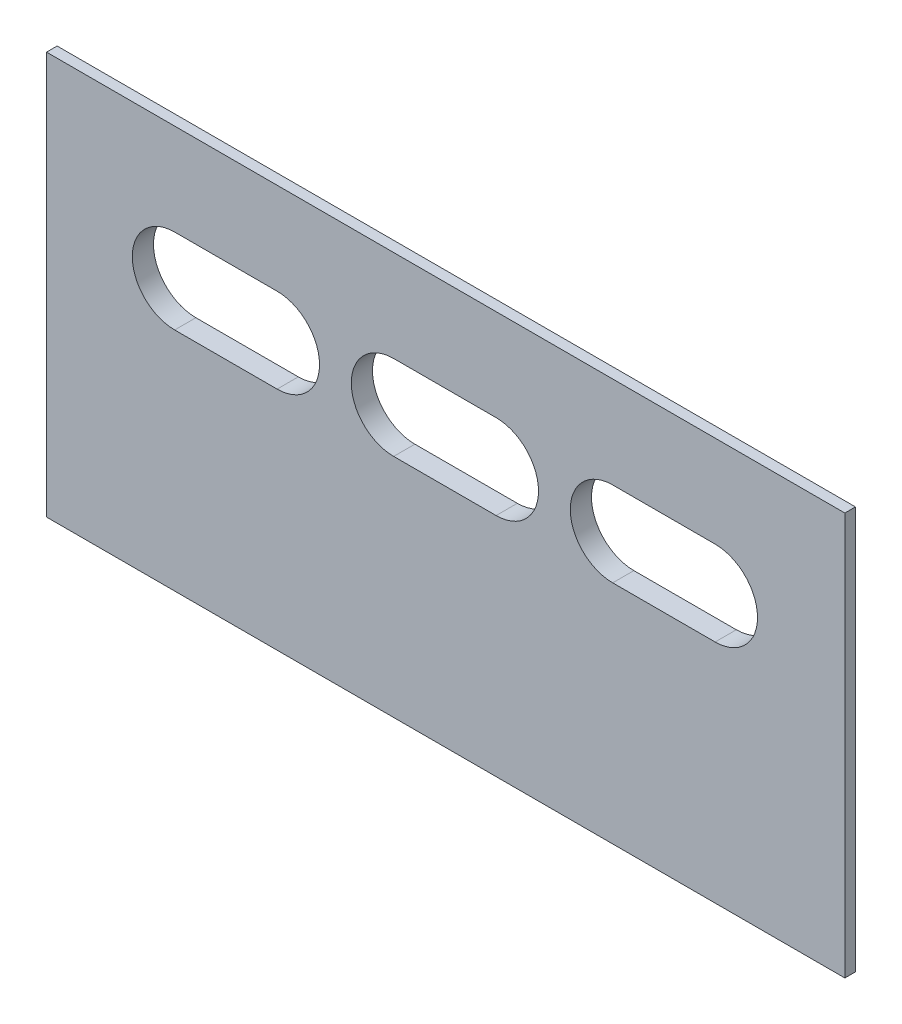
ISO-10303-21;
HEADER;
FILE_DESCRIPTION(('STEP AP214'),'2;1');
FILE_NAME('part.step','',(''),(''),'','','');
FILE_SCHEMA(('AUTOMOTIVE_DESIGN { 1 0 10303 214 1 1 1 1 }'));
ENDSEC;
DATA;
#1=APPLICATION_CONTEXT('core data for automotive mechanical design processes');
#2=APPLICATION_PROTOCOL_DEFINITION('international standard','automotive_design',2000,#1);
#3=PRODUCT_CONTEXT('',#1,'mechanical');
#4=PRODUCT('Part','Part','',(#3));
#5=PRODUCT_RELATED_PRODUCT_CATEGORY('part','',(#4));
#6=PRODUCT_DEFINITION_FORMATION('','',#4);
#7=PRODUCT_DEFINITION_CONTEXT('part definition',#1,'design');
#8=PRODUCT_DEFINITION('design','',#6,#7);
#9=PRODUCT_DEFINITION_SHAPE('','',#8);
#10=(LENGTH_UNIT() NAMED_UNIT(*) SI_UNIT(.MILLI.,.METRE.));
#11=(NAMED_UNIT(*) PLANE_ANGLE_UNIT() SI_UNIT($,.RADIAN.));
#12=(NAMED_UNIT(*) SI_UNIT($,.STERADIAN.) SOLID_ANGLE_UNIT());
#13=UNCERTAINTY_MEASURE_WITH_UNIT(LENGTH_MEASURE(1.E-05),#10,'distance_accuracy_value','');
#14=(GEOMETRIC_REPRESENTATION_CONTEXT(3) GLOBAL_UNCERTAINTY_ASSIGNED_CONTEXT((#13)) GLOBAL_UNIT_ASSIGNED_CONTEXT((#10,
#11,#12)) REPRESENTATION_CONTEXT('',''));
#15=CARTESIAN_POINT('',(0.,0.,0.));
#16=DIRECTION('',(0.,0.,1.));
#17=DIRECTION('',(1.,0.,0.));
#18=AXIS2_PLACEMENT_3D('',#15,#16,#17);
#19=CARTESIAN_POINT('',(5.,5.,37.5));
#20=DIRECTION('',(0.,0.,1.));
#21=DIRECTION('',(1.,0.,0.));
#22=AXIS2_PLACEMENT_3D('',#19,#20,#21);
#23=PLANE('',#22);
#24=DIRECTION('',(-1.,0.,0.));
#25=VECTOR('',#24,1.);
#26=CARTESIAN_POINT('',(43.568325892304,46.009172801273,37.5));
#27=LINE('',#26,#25);
#28=CARTESIAN_POINT('',(96.636651784609,46.009172801273,37.5));
#29=VERTEX_POINT('',#28);
#30=CARTESIAN_POINT('',(82.136651784609,46.009172801273,37.5));
#31=VERTEX_POINT('',#30);
#32=EDGE_CURVE('E430',#29,#31,#27,.T.);
#33=ORIENTED_EDGE('',*,*,#32,.T.);
#34=CARTESIAN_POINT('',(82.136651784609,40.009172801273,37.5));
#35=DIRECTION('',(0.,0.,-1.));
#36=DIRECTION('',(1.,0.,0.));
#37=AXIS2_PLACEMENT_3D('',#34,#35,#36);
#38=CIRCLE('',#37,6.);
#39=CARTESIAN_POINT('',(82.136651784609,34.009172801273,37.5));
#40=VERTEX_POINT('',#39);
#41=EDGE_CURVE('E438',#40,#31,#38,.T.);
#42=ORIENTED_EDGE('',*,*,#41,.F.);
#43=DIRECTION('',(-1.,0.,0.));
#44=VECTOR('',#43,1.);
#45=CARTESIAN_POINT('',(43.568325892304,34.009172801273,37.5));
#46=LINE('',#45,#44);
#47=CARTESIAN_POINT('',(96.636651784609,34.009172801273,37.5));
#48=VERTEX_POINT('',#47);
#49=EDGE_CURVE('E413',#48,#40,#46,.T.);
#50=ORIENTED_EDGE('',*,*,#49,.F.);
#51=CARTESIAN_POINT('',(96.636651784609,40.009172801273,37.5));
#52=DIRECTION('',(0.,0.,-1.));
#53=DIRECTION('',(1.,0.,0.));
#54=AXIS2_PLACEMENT_3D('',#51,#52,#53);
#55=CIRCLE('',#54,6.);
#56=EDGE_CURVE('E421',#29,#48,#55,.T.);
#57=ORIENTED_EDGE('',*,*,#56,.F.);
#58=EDGE_LOOP('',(#33,#42,#50,#57));
#59=FACE_BOUND('',#58,.T.);
#60=DIRECTION('',(-1.,0.,0.));
#61=VECTOR('',#60,1.);
#62=CARTESIAN_POINT('',(28.068325892304,46.009172801273,37.5));
#63=LINE('',#62,#61);
#64=CARTESIAN_POINT('',(65.636641784609,46.009172801273,37.5));
#65=VERTEX_POINT('',#64);
#66=CARTESIAN_POINT('',(51.136651784609,46.009172801273,37.5));
#67=VERTEX_POINT('',#66);
#68=EDGE_CURVE('E409',#65,#67,#63,.T.);
#69=ORIENTED_EDGE('',*,*,#68,.T.);
#70=CARTESIAN_POINT('',(51.136651784609,40.009172801273,37.5));
#71=DIRECTION('',(0.,0.,-1.));
#72=DIRECTION('',(1.,0.,0.));
#73=AXIS2_PLACEMENT_3D('',#70,#71,#72);
#74=CIRCLE('',#73,6.);
#75=CARTESIAN_POINT('',(51.136651784609,34.009172801273,37.5));
#76=VERTEX_POINT('',#75);
#77=EDGE_CURVE('E335',#76,#67,#74,.T.);
#78=ORIENTED_EDGE('',*,*,#77,.F.);
#79=DIRECTION('',(-1.,0.,0.));
#80=VECTOR('',#79,1.);
#81=CARTESIAN_POINT('',(28.068325892304,34.009172801273,37.5));
#82=LINE('',#81,#80);
#83=CARTESIAN_POINT('',(65.636641784609,34.009172801273,37.5));
#84=VERTEX_POINT('',#83);
#85=EDGE_CURVE('E412',#84,#76,#82,.T.);
#86=ORIENTED_EDGE('',*,*,#85,.F.);
#87=CARTESIAN_POINT('',(65.636641784609,40.009172801273,37.5));
#88=DIRECTION('',(0.,0.,-1.));
#89=DIRECTION('',(1.,0.,0.));
#90=AXIS2_PLACEMENT_3D('',#87,#88,#89);
#91=CIRCLE('',#90,6.);
#92=EDGE_CURVE('E372',#65,#84,#91,.T.);
#93=ORIENTED_EDGE('',*,*,#92,.F.);
#94=EDGE_LOOP('',(#69,#78,#86,#93));
#95=FACE_BOUND('',#94,.T.);
#96=DIRECTION('',(-1.,0.,0.));
#97=VECTOR('',#96,1.);
#98=CARTESIAN_POINT('',(12.568325892304,46.009172801273,37.5));
#99=LINE('',#98,#97);
#100=CARTESIAN_POINT('',(34.636651784609,46.009172801273,37.5));
#101=VERTEX_POINT('',#100);
#102=CARTESIAN_POINT('',(20.136651784609,46.009172801273,37.5));
#103=VERTEX_POINT('',#102);
#104=EDGE_CURVE('E380',#101,#103,#99,.T.);
#105=ORIENTED_EDGE('',*,*,#104,.T.);
#106=CARTESIAN_POINT('',(20.136651784609,40.009172801273,37.5));
#107=DIRECTION('',(0.,0.,-1.));
#108=DIRECTION('',(1.,0.,0.));
#109=AXIS2_PLACEMENT_3D('',#106,#107,#108);
#110=CIRCLE('',#109,6.);
#111=CARTESIAN_POINT('',(20.136651784609,34.009172801273,37.5));
#112=VERTEX_POINT('',#111);
#113=EDGE_CURVE('E391',#112,#103,#110,.T.);
#114=ORIENTED_EDGE('',*,*,#113,.F.);
#115=DIRECTION('',(-1.,0.,0.));
#116=VECTOR('',#115,1.);
#117=CARTESIAN_POINT('',(12.568325892304,34.009172801273,37.5));
#118=LINE('',#117,#116);
#119=CARTESIAN_POINT('',(34.636651784609,34.009172801273,37.5));
#120=VERTEX_POINT('',#119);
#121=EDGE_CURVE('E384',#120,#112,#118,.T.);
#122=ORIENTED_EDGE('',*,*,#121,.F.);
#123=CARTESIAN_POINT('',(34.636651784609,40.009172801273,37.5));
#124=DIRECTION('',(0.,0.,-1.));
#125=DIRECTION('',(1.,0.,0.));
#126=AXIS2_PLACEMENT_3D('',#123,#124,#125);
#127=CIRCLE('',#126,6.);
#128=EDGE_CURVE('E362',#101,#120,#127,.T.);
#129=ORIENTED_EDGE('',*,*,#128,.F.);
#130=EDGE_LOOP('',(#105,#114,#122,#129));
#131=FACE_BOUND('',#130,.T.);
#132=CARTESIAN_POINT('',(5.,12.,37.5));
#133=DIRECTION('',(0.,0.,1.));
#134=DIRECTION('',(0.,-1.,0.));
#135=AXIS2_PLACEMENT_3D('',#132,#133,#134);
#136=CIRCLE('',#135,1.5);
#137=CARTESIAN_POINT('',(5.,10.5,37.5));
#138=VERTEX_POINT('',#137);
#139=CARTESIAN_POINT('',(5.,13.5,37.5));
#140=VERTEX_POINT('',#139);
#141=EDGE_CURVE('E154',#138,#140,#136,.T.);
#142=ORIENTED_EDGE('',*,*,#141,.T.);
#143=DIRECTION('',(0.,1.,0.));
#144=VECTOR('',#143,1.);
#145=CARTESIAN_POINT('',(5.,5.,37.5));
#146=LINE('',#145,#144);
#147=CARTESIAN_POINT('',(5.,29.,37.5));
#148=VERTEX_POINT('',#147);
#149=EDGE_CURVE('E166',#140,#148,#146,.T.);
#150=ORIENTED_EDGE('',*,*,#149,.T.);
#151=CARTESIAN_POINT('',(5.,30.5,37.5));
#152=DIRECTION('',(0.,0.,1.));
#153=DIRECTION('',(0.,-1.,0.));
#154=AXIS2_PLACEMENT_3D('',#151,#152,#153);
#155=CIRCLE('',#154,1.5);
#156=CARTESIAN_POINT('',(5.,32.,37.5));
#157=VERTEX_POINT('',#156);
#158=EDGE_CURVE('E397',#148,#157,#155,.T.);
#159=ORIENTED_EDGE('',*,*,#158,.T.);
#160=DIRECTION('',(0.,1.,0.));
#161=VECTOR('',#160,1.);
#162=CARTESIAN_POINT('',(5.,5.,37.5));
#163=LINE('',#162,#161);
#164=CARTESIAN_POINT('',(5.,47.5,37.5));
#165=VERTEX_POINT('',#164);
#166=EDGE_CURVE('E488',#157,#165,#163,.T.);
#167=ORIENTED_EDGE('',*,*,#166,.T.);
#168=CARTESIAN_POINT('',(5.,49.,37.5));
#169=DIRECTION('',(0.,0.,1.));
#170=DIRECTION('',(0.,-1.,0.));
#171=AXIS2_PLACEMENT_3D('',#168,#169,#170);
#172=CIRCLE('',#171,1.5);
#173=CARTESIAN_POINT('',(5.,50.5,37.5));
#174=VERTEX_POINT('',#173);
#175=EDGE_CURVE('E491',#165,#174,#172,.T.);
#176=ORIENTED_EDGE('',*,*,#175,.T.);
#177=DIRECTION('',(0.,1.,0.));
#178=VECTOR('',#177,1.);
#179=CARTESIAN_POINT('',(5.,5.,37.5));
#180=LINE('',#179,#178);
#181=CARTESIAN_POINT('',(5.,56.,37.5));
#182=VERTEX_POINT('',#181);
#183=EDGE_CURVE('E9',#174,#182,#180,.T.);
#184=ORIENTED_EDGE('',*,*,#183,.T.);
#185=DIRECTION('',(1.,0.,0.));
#186=VECTOR('',#185,1.);
#187=CARTESIAN_POINT('',(5.,56.,37.5));
#188=LINE('',#187,#186);
#189=CARTESIAN_POINT('',(112.,56.,37.5));
#190=VERTEX_POINT('',#189);
#191=EDGE_CURVE('E416',#182,#190,#188,.T.);
#192=ORIENTED_EDGE('',*,*,#191,.T.);
#193=DIRECTION('',(0.,1.,0.));
#194=VECTOR('',#193,1.);
#195=CARTESIAN_POINT('',(112.,5.,37.5));
#196=LINE('',#195,#194);
#197=CARTESIAN_POINT('',(112.,50.5,37.5));
#198=VERTEX_POINT('',#197);
#199=EDGE_CURVE('E363',#198,#190,#196,.T.);
#200=ORIENTED_EDGE('',*,*,#199,.F.);
#201=CARTESIAN_POINT('',(112.,49.,37.5));
#202=DIRECTION('',(0.,0.,-1.));
#203=DIRECTION('',(1.,0.,0.));
#204=AXIS2_PLACEMENT_3D('',#201,#202,#203);
#205=CIRCLE('',#204,1.5);
#206=CARTESIAN_POINT('',(112.,47.5,37.5));
#207=VERTEX_POINT('',#206);
#208=EDGE_CURVE('E406',#207,#198,#205,.T.);
#209=ORIENTED_EDGE('',*,*,#208,.F.);
#210=DIRECTION('',(0.,1.,0.));
#211=VECTOR('',#210,1.);
#212=CARTESIAN_POINT('',(112.,5.,37.5));
#213=LINE('',#212,#211);
#214=CARTESIAN_POINT('',(112.,32.,37.5));
#215=VERTEX_POINT('',#214);
#216=EDGE_CURVE('E405',#215,#207,#213,.T.);
#217=ORIENTED_EDGE('',*,*,#216,.F.);
#218=CARTESIAN_POINT('',(112.,30.5,37.5));
#219=DIRECTION('',(0.,0.,-1.));
#220=DIRECTION('',(1.,0.,0.));
#221=AXIS2_PLACEMENT_3D('',#218,#219,#220);
#222=CIRCLE('',#221,1.5);
#223=CARTESIAN_POINT('',(112.,29.,37.5));
#224=VERTEX_POINT('',#223);
#225=EDGE_CURVE('E305',#224,#215,#222,.T.);
#226=ORIENTED_EDGE('',*,*,#225,.F.);
#227=DIRECTION('',(0.,1.,0.));
#228=VECTOR('',#227,1.);
#229=CARTESIAN_POINT('',(112.,5.,37.5));
#230=LINE('',#229,#228);
#231=CARTESIAN_POINT('',(112.,13.5,37.5));
#232=VERTEX_POINT('',#231);
#233=EDGE_CURVE('E304',#232,#224,#230,.T.);
#234=ORIENTED_EDGE('',*,*,#233,.F.);
#235=CARTESIAN_POINT('',(112.,12.,37.5));
#236=DIRECTION('',(0.,0.,-1.));
#237=DIRECTION('',(1.,0.,0.));
#238=AXIS2_PLACEMENT_3D('',#235,#236,#237);
#239=CIRCLE('',#238,1.5);
#240=CARTESIAN_POINT('',(112.,10.5,37.5));
#241=VERTEX_POINT('',#240);
#242=EDGE_CURVE('E300',#241,#232,#239,.T.);
#243=ORIENTED_EDGE('',*,*,#242,.F.);
#244=DIRECTION('',(0.,1.,0.));
#245=VECTOR('',#244,1.);
#246=CARTESIAN_POINT('',(112.,5.,37.5));
#247=LINE('',#246,#245);
#248=CARTESIAN_POINT('',(112.,5.,37.5));
#249=VERTEX_POINT('',#248);
#250=EDGE_CURVE('E470',#249,#241,#247,.T.);
#251=ORIENTED_EDGE('',*,*,#250,.F.);
#252=DIRECTION('',(1.,0.,0.));
#253=VECTOR('',#252,1.);
#254=CARTESIAN_POINT('',(5.,5.,37.5));
#255=LINE('',#254,#253);
#256=CARTESIAN_POINT('',(5.,5.,37.5));
#257=VERTEX_POINT('',#256);
#258=EDGE_CURVE('E449',#257,#249,#255,.T.);
#259=ORIENTED_EDGE('',*,*,#258,.F.);
#260=DIRECTION('',(0.,1.,0.));
#261=VECTOR('',#260,1.);
#262=CARTESIAN_POINT('',(5.,5.,37.5));
#263=LINE('',#262,#261);
#264=EDGE_CURVE('E333',#257,#138,#263,.T.);
#265=ORIENTED_EDGE('',*,*,#264,.T.);
#266=EDGE_LOOP('',(#142,#150,#159,#167,#176,#184,#192,#200,#209,#217,#226,#234,#243,#251,#259,#265));
#267=FACE_BOUND('',#266,.T.);
#268=ADVANCED_FACE('F15',(#59,#95,#131,#267),#23,.F.);
#269=CARTESIAN_POINT('',(5.,5.,37.5));
#270=DIRECTION('',(1.,0.,0.));
#271=DIRECTION('',(0.,1.,0.));
#272=AXIS2_PLACEMENT_3D('',#269,#270,#271);
#273=PLANE('',#272);
#274=DIRECTION('',(0.,0.,1.));
#275=VECTOR('',#274,1.);
#276=CARTESIAN_POINT('',(5.,56.,37.5));
#277=LINE('',#276,#275);
#278=CARTESIAN_POINT('',(5.,56.,39.));
#279=VERTEX_POINT('',#278);
#280=EDGE_CURVE('E446',#182,#279,#277,.T.);
#281=ORIENTED_EDGE('',*,*,#280,.F.);
#282=ORIENTED_EDGE('',*,*,#183,.F.);
#283=DIRECTION('',(0.,0.,-1.));
#284=VECTOR('',#283,1.);
#285=CARTESIAN_POINT('',(5.,50.5,37.));
#286=LINE('',#285,#284);
#287=CARTESIAN_POINT('',(5.,50.5,39.));
#288=VERTEX_POINT('',#287);
#289=EDGE_CURVE('E24',#288,#174,#286,.T.);
#290=ORIENTED_EDGE('',*,*,#289,.F.);
#291=DIRECTION('',(0.,1.,0.));
#292=VECTOR('',#291,1.);
#293=CARTESIAN_POINT('',(5.,5.,39.));
#294=LINE('',#293,#292);
#295=EDGE_CURVE('E547',#288,#279,#294,.T.);
#296=ORIENTED_EDGE('',*,*,#295,.T.);
#297=EDGE_LOOP('',(#281,#282,#290,#296));
#298=FACE_BOUND('',#297,.T.);
#299=ADVANCED_FACE('F631',(#298),#273,.F.);
#300=CARTESIAN_POINT('',(5.,49.,37.));
#301=DIRECTION('',(0.,0.,-1.));
#302=DIRECTION('',(1.,0.,0.));
#303=AXIS2_PLACEMENT_3D('',#300,#301,#302);
#304=CYLINDRICAL_SURFACE('',#303,1.5);
#305=ORIENTED_EDGE('',*,*,#175,.F.);
#306=DIRECTION('',(0.,0.,-1.));
#307=VECTOR('',#306,1.);
#308=CARTESIAN_POINT('',(5.,47.5,37.));
#309=LINE('',#308,#307);
#310=CARTESIAN_POINT('',(5.,47.5,39.));
#311=VERTEX_POINT('',#310);
#312=EDGE_CURVE('E484',#311,#165,#309,.T.);
#313=ORIENTED_EDGE('',*,*,#312,.F.);
#314=CARTESIAN_POINT('',(5.,49.,39.));
#315=DIRECTION('',(0.,0.,-1.));
#316=DIRECTION('',(0.,1.,0.));
#317=AXIS2_PLACEMENT_3D('',#314,#315,#316);
#318=CIRCLE('',#317,1.5);
#319=EDGE_CURVE('E555',#288,#311,#318,.T.);
#320=ORIENTED_EDGE('',*,*,#319,.F.);
#321=ORIENTED_EDGE('',*,*,#289,.T.);
#322=EDGE_LOOP('',(#305,#313,#320,#321));
#323=FACE_BOUND('',#322,.T.);
#324=ADVANCED_FACE('F662',(#323),#304,.F.);
#325=CARTESIAN_POINT('',(5.,5.,37.5));
#326=DIRECTION('',(1.,0.,0.));
#327=DIRECTION('',(0.,1.,0.));
#328=AXIS2_PLACEMENT_3D('',#325,#326,#327);
#329=PLANE('',#328);
#330=ORIENTED_EDGE('',*,*,#312,.T.);
#331=ORIENTED_EDGE('',*,*,#166,.F.);
#332=DIRECTION('',(0.,0.,-1.));
#333=VECTOR('',#332,1.);
#334=CARTESIAN_POINT('',(5.,32.,37.));
#335=LINE('',#334,#333);
#336=CARTESIAN_POINT('',(5.,32.,39.));
#337=VERTEX_POINT('',#336);
#338=EDGE_CURVE('E480',#337,#157,#335,.T.);
#339=ORIENTED_EDGE('',*,*,#338,.F.);
#340=DIRECTION('',(0.,1.,0.));
#341=VECTOR('',#340,1.);
#342=CARTESIAN_POINT('',(5.,5.,39.));
#343=LINE('',#342,#341);
#344=EDGE_CURVE('E559',#337,#311,#343,.T.);
#345=ORIENTED_EDGE('',*,*,#344,.T.);
#346=EDGE_LOOP('',(#330,#331,#339,#345));
#347=FACE_BOUND('',#346,.T.);
#348=ADVANCED_FACE('F947',(#347),#329,.F.);
#349=CARTESIAN_POINT('',(5.,30.5,37.));
#350=DIRECTION('',(0.,0.,-1.));
#351=DIRECTION('',(1.,0.,0.));
#352=AXIS2_PLACEMENT_3D('',#349,#350,#351);
#353=CYLINDRICAL_SURFACE('',#352,1.5);
#354=ORIENTED_EDGE('',*,*,#158,.F.);
#355=DIRECTION('',(0.,0.,-1.));
#356=VECTOR('',#355,1.);
#357=CARTESIAN_POINT('',(5.,29.,37.));
#358=LINE('',#357,#356);
#359=CARTESIAN_POINT('',(5.,29.,39.));
#360=VERTEX_POINT('',#359);
#361=EDGE_CURVE('E398',#360,#148,#358,.T.);
#362=ORIENTED_EDGE('',*,*,#361,.F.);
#363=CARTESIAN_POINT('',(5.,30.5,39.));
#364=DIRECTION('',(0.,0.,-1.));
#365=DIRECTION('',(0.,1.,0.));
#366=AXIS2_PLACEMENT_3D('',#363,#364,#365);
#367=CIRCLE('',#366,1.5);
#368=EDGE_CURVE('E563',#337,#360,#367,.T.);
#369=ORIENTED_EDGE('',*,*,#368,.F.);
#370=ORIENTED_EDGE('',*,*,#338,.T.);
#371=EDGE_LOOP('',(#354,#362,#369,#370));
#372=FACE_BOUND('',#371,.T.);
#373=ADVANCED_FACE('F944',(#372),#353,.F.);
#374=CARTESIAN_POINT('',(5.,5.,37.5));
#375=DIRECTION('',(1.,0.,0.));
#376=DIRECTION('',(0.,1.,0.));
#377=AXIS2_PLACEMENT_3D('',#374,#375,#376);
#378=PLANE('',#377);
#379=ORIENTED_EDGE('',*,*,#361,.T.);
#380=ORIENTED_EDGE('',*,*,#149,.F.);
#381=DIRECTION('',(0.,0.,-1.));
#382=VECTOR('',#381,1.);
#383=CARTESIAN_POINT('',(5.,13.5,37.));
#384=LINE('',#383,#382);
#385=CARTESIAN_POINT('',(5.,13.5,39.));
#386=VERTEX_POINT('',#385);
#387=EDGE_CURVE('E332',#386,#140,#384,.T.);
#388=ORIENTED_EDGE('',*,*,#387,.F.);
#389=DIRECTION('',(0.,1.,0.));
#390=VECTOR('',#389,1.);
#391=CARTESIAN_POINT('',(5.,5.,39.));
#392=LINE('',#391,#390);
#393=EDGE_CURVE('E569',#386,#360,#392,.T.);
#394=ORIENTED_EDGE('',*,*,#393,.T.);
#395=EDGE_LOOP('',(#379,#380,#388,#394));
#396=FACE_BOUND('',#395,.T.);
#397=ADVANCED_FACE('F941',(#396),#378,.F.);
#398=CARTESIAN_POINT('',(5.,12.,37.));
#399=DIRECTION('',(0.,0.,-1.));
#400=DIRECTION('',(1.,0.,0.));
#401=AXIS2_PLACEMENT_3D('',#398,#399,#400);
#402=CYLINDRICAL_SURFACE('',#401,1.5);
#403=ORIENTED_EDGE('',*,*,#141,.F.);
#404=DIRECTION('',(0.,0.,-1.));
#405=VECTOR('',#404,1.);
#406=CARTESIAN_POINT('',(5.,10.5,37.));
#407=LINE('',#406,#405);
#408=CARTESIAN_POINT('',(5.,10.5,39.));
#409=VERTEX_POINT('',#408);
#410=EDGE_CURVE('E452',#409,#138,#407,.T.);
#411=ORIENTED_EDGE('',*,*,#410,.F.);
#412=CARTESIAN_POINT('',(5.,12.,39.));
#413=DIRECTION('',(0.,0.,-1.));
#414=DIRECTION('',(0.,1.,0.));
#415=AXIS2_PLACEMENT_3D('',#412,#413,#414);
#416=CIRCLE('',#415,1.5);
#417=EDGE_CURVE('E573',#386,#409,#416,.T.);
#418=ORIENTED_EDGE('',*,*,#417,.F.);
#419=ORIENTED_EDGE('',*,*,#387,.T.);
#420=EDGE_LOOP('',(#403,#411,#418,#419));
#421=FACE_BOUND('',#420,.T.);
#422=ADVANCED_FACE('F929',(#421),#402,.F.);
#423=CARTESIAN_POINT('',(5.,5.,37.5));
#424=DIRECTION('',(1.,0.,0.));
#425=DIRECTION('',(0.,1.,0.));
#426=AXIS2_PLACEMENT_3D('',#423,#424,#425);
#427=PLANE('',#426);
#428=ORIENTED_EDGE('',*,*,#410,.T.);
#429=ORIENTED_EDGE('',*,*,#264,.F.);
#430=DIRECTION('',(0.,0.,1.));
#431=VECTOR('',#430,1.);
#432=CARTESIAN_POINT('',(5.,5.,37.5));
#433=LINE('',#432,#431);
#434=CARTESIAN_POINT('',(5.,5.,39.));
#435=VERTEX_POINT('',#434);
#436=EDGE_CURVE('E453',#257,#435,#433,.T.);
#437=ORIENTED_EDGE('',*,*,#436,.T.);
#438=DIRECTION('',(0.,1.,0.));
#439=VECTOR('',#438,1.);
#440=CARTESIAN_POINT('',(5.,5.,39.));
#441=LINE('',#440,#439);
#442=EDGE_CURVE('E577',#435,#409,#441,.T.);
#443=ORIENTED_EDGE('',*,*,#442,.T.);
#444=EDGE_LOOP('',(#428,#429,#437,#443));
#445=FACE_BOUND('',#444,.T.);
#446=ADVANCED_FACE('F768',(#445),#427,.F.);
#447=CARTESIAN_POINT('',(5.,5.,37.5));
#448=DIRECTION('',(0.,1.,0.));
#449=DIRECTION('',(1.,0.,0.));
#450=AXIS2_PLACEMENT_3D('',#447,#448,#449);
#451=PLANE('',#450);
#452=DIRECTION('',(0.,0.,1.));
#453=VECTOR('',#452,1.);
#454=CARTESIAN_POINT('',(112.,5.,37.5));
#455=LINE('',#454,#453);
#456=CARTESIAN_POINT('',(112.,5.,39.));
#457=VERTEX_POINT('',#456);
#458=EDGE_CURVE('E467',#249,#457,#455,.T.);
#459=ORIENTED_EDGE('',*,*,#458,.T.);
#460=DIRECTION('',(1.,0.,0.));
#461=VECTOR('',#460,1.);
#462=CARTESIAN_POINT('',(5.,5.,39.));
#463=LINE('',#462,#461);
#464=EDGE_CURVE('E328',#435,#457,#463,.T.);
#465=ORIENTED_EDGE('',*,*,#464,.F.);
#466=ORIENTED_EDGE('',*,*,#436,.F.);
#467=ORIENTED_EDGE('',*,*,#258,.T.);
#468=EDGE_LOOP('',(#459,#465,#466,#467));
#469=FACE_BOUND('',#468,.T.);
#470=ADVANCED_FACE('F765',(#469),#451,.F.);
#471=CARTESIAN_POINT('',(112.,5.,37.5));
#472=DIRECTION('',(1.,0.,0.));
#473=DIRECTION('',(0.,1.,0.));
#474=AXIS2_PLACEMENT_3D('',#471,#472,#473);
#475=PLANE('',#474);
#476=DIRECTION('',(0.,1.,0.));
#477=VECTOR('',#476,1.);
#478=CARTESIAN_POINT('',(112.,5.,39.));
#479=LINE('',#478,#477);
#480=CARTESIAN_POINT('',(112.,10.5,39.));
#481=VERTEX_POINT('',#480);
#482=EDGE_CURVE('E322',#457,#481,#479,.T.);
#483=ORIENTED_EDGE('',*,*,#482,.F.);
#484=ORIENTED_EDGE('',*,*,#458,.F.);
#485=ORIENTED_EDGE('',*,*,#250,.T.);
#486=DIRECTION('',(0.,0.,-1.));
#487=VECTOR('',#486,1.);
#488=CARTESIAN_POINT('',(112.,10.5,37.));
#489=LINE('',#488,#487);
#490=EDGE_CURVE('E287',#481,#241,#489,.T.);
#491=ORIENTED_EDGE('',*,*,#490,.F.);
#492=EDGE_LOOP('',(#483,#484,#485,#491));
#493=FACE_BOUND('',#492,.T.);
#494=ADVANCED_FACE('F588',(#493),#475,.T.);
#495=CARTESIAN_POINT('',(112.,12.,37.));
#496=DIRECTION('',(0.,0.,-1.));
#497=DIRECTION('',(1.,0.,0.));
#498=AXIS2_PLACEMENT_3D('',#495,#496,#497);
#499=CYLINDRICAL_SURFACE('',#498,1.5);
#500=DIRECTION('',(0.,0.,-1.));
#501=VECTOR('',#500,1.);
#502=CARTESIAN_POINT('',(112.,13.5,37.));
#503=LINE('',#502,#501);
#504=CARTESIAN_POINT('',(112.,13.5,39.));
#505=VERTEX_POINT('',#504);
#506=EDGE_CURVE('E293',#505,#232,#503,.T.);
#507=ORIENTED_EDGE('',*,*,#506,.F.);
#508=CARTESIAN_POINT('',(112.,12.,39.));
#509=DIRECTION('',(0.,0.,1.));
#510=DIRECTION('',(1.,0.,0.));
#511=AXIS2_PLACEMENT_3D('',#508,#509,#510);
#512=CIRCLE('',#511,1.5);
#513=EDGE_CURVE('E297',#505,#481,#512,.T.);
#514=ORIENTED_EDGE('',*,*,#513,.T.);
#515=ORIENTED_EDGE('',*,*,#490,.T.);
#516=ORIENTED_EDGE('',*,*,#242,.T.);
#517=EDGE_LOOP('',(#507,#514,#515,#516));
#518=FACE_BOUND('',#517,.T.);
#519=ADVANCED_FACE('F295',(#518),#499,.F.);
#520=CARTESIAN_POINT('',(112.,5.,37.5));
#521=DIRECTION('',(1.,0.,0.));
#522=DIRECTION('',(0.,1.,0.));
#523=AXIS2_PLACEMENT_3D('',#520,#521,#522);
#524=PLANE('',#523);
#525=DIRECTION('',(0.,1.,0.));
#526=VECTOR('',#525,1.);
#527=CARTESIAN_POINT('',(112.,5.,39.));
#528=LINE('',#527,#526);
#529=CARTESIAN_POINT('',(112.,29.,39.));
#530=VERTEX_POINT('',#529);
#531=EDGE_CURVE('E308',#505,#530,#528,.T.);
#532=ORIENTED_EDGE('',*,*,#531,.F.);
#533=ORIENTED_EDGE('',*,*,#506,.T.);
#534=ORIENTED_EDGE('',*,*,#233,.T.);
#535=DIRECTION('',(0.,0.,-1.));
#536=VECTOR('',#535,1.);
#537=CARTESIAN_POINT('',(112.,29.,37.));
#538=LINE('',#537,#536);
#539=EDGE_CURVE('E311',#530,#224,#538,.T.);
#540=ORIENTED_EDGE('',*,*,#539,.F.);
#541=EDGE_LOOP('',(#532,#533,#534,#540));
#542=FACE_BOUND('',#541,.T.);
#543=ADVANCED_FACE('F309',(#542),#524,.T.);
#544=CARTESIAN_POINT('',(112.,30.5,37.));
#545=DIRECTION('',(0.,0.,-1.));
#546=DIRECTION('',(1.,0.,0.));
#547=AXIS2_PLACEMENT_3D('',#544,#545,#546);
#548=CYLINDRICAL_SURFACE('',#547,1.5);
#549=DIRECTION('',(0.,0.,-1.));
#550=VECTOR('',#549,1.);
#551=CARTESIAN_POINT('',(112.,32.,37.));
#552=LINE('',#551,#550);
#553=CARTESIAN_POINT('',(112.,32.,39.));
#554=VERTEX_POINT('',#553);
#555=EDGE_CURVE('E401',#554,#215,#552,.T.);
#556=ORIENTED_EDGE('',*,*,#555,.F.);
#557=CARTESIAN_POINT('',(112.,30.5,39.));
#558=DIRECTION('',(0.,0.,1.));
#559=DIRECTION('',(1.,0.,0.));
#560=AXIS2_PLACEMENT_3D('',#557,#558,#559);
#561=CIRCLE('',#560,1.5);
#562=EDGE_CURVE('E316',#554,#530,#561,.T.);
#563=ORIENTED_EDGE('',*,*,#562,.T.);
#564=ORIENTED_EDGE('',*,*,#539,.T.);
#565=ORIENTED_EDGE('',*,*,#225,.T.);
#566=EDGE_LOOP('',(#556,#563,#564,#565));
#567=FACE_BOUND('',#566,.T.);
#568=ADVANCED_FACE('F594',(#567),#548,.F.);
#569=CARTESIAN_POINT('',(112.,5.,37.5));
#570=DIRECTION('',(1.,0.,0.));
#571=DIRECTION('',(0.,1.,0.));
#572=AXIS2_PLACEMENT_3D('',#569,#570,#571);
#573=PLANE('',#572);
#574=DIRECTION('',(0.,1.,0.));
#575=VECTOR('',#574,1.);
#576=CARTESIAN_POINT('',(112.,5.,39.));
#577=LINE('',#576,#575);
#578=CARTESIAN_POINT('',(112.,47.5,39.));
#579=VERTEX_POINT('',#578);
#580=EDGE_CURVE('E340',#554,#579,#577,.T.);
#581=ORIENTED_EDGE('',*,*,#580,.F.);
#582=ORIENTED_EDGE('',*,*,#555,.T.);
#583=ORIENTED_EDGE('',*,*,#216,.T.);
#584=DIRECTION('',(0.,0.,-1.));
#585=VECTOR('',#584,1.);
#586=CARTESIAN_POINT('',(112.,47.5,37.));
#587=LINE('',#586,#585);
#588=EDGE_CURVE('E366',#579,#207,#587,.T.);
#589=ORIENTED_EDGE('',*,*,#588,.F.);
#590=EDGE_LOOP('',(#581,#582,#583,#589));
#591=FACE_BOUND('',#590,.T.);
#592=ADVANCED_FACE('F647',(#591),#573,.T.);
#593=CARTESIAN_POINT('',(112.,49.,37.));
#594=DIRECTION('',(0.,0.,-1.));
#595=DIRECTION('',(1.,0.,0.));
#596=AXIS2_PLACEMENT_3D('',#593,#594,#595);
#597=CYLINDRICAL_SURFACE('',#596,1.5);
#598=DIRECTION('',(0.,0.,-1.));
#599=VECTOR('',#598,1.);
#600=CARTESIAN_POINT('',(112.,50.5,37.));
#601=LINE('',#600,#599);
#602=CARTESIAN_POINT('',(112.,50.5,39.));
#603=VERTEX_POINT('',#602);
#604=EDGE_CURVE('E367',#603,#198,#601,.T.);
#605=ORIENTED_EDGE('',*,*,#604,.F.);
#606=CARTESIAN_POINT('',(112.,49.,39.));
#607=DIRECTION('',(0.,0.,1.));
#608=DIRECTION('',(1.,0.,0.));
#609=AXIS2_PLACEMENT_3D('',#606,#607,#608);
#610=CIRCLE('',#609,1.5);
#611=EDGE_CURVE('E344',#603,#579,#610,.T.);
#612=ORIENTED_EDGE('',*,*,#611,.T.);
#613=ORIENTED_EDGE('',*,*,#588,.T.);
#614=ORIENTED_EDGE('',*,*,#208,.T.);
#615=EDGE_LOOP('',(#605,#612,#613,#614));
#616=FACE_BOUND('',#615,.T.);
#617=ADVANCED_FACE('F644',(#616),#597,.F.);
#618=CARTESIAN_POINT('',(112.,5.,37.5));
#619=DIRECTION('',(1.,0.,0.));
#620=DIRECTION('',(0.,1.,0.));
#621=AXIS2_PLACEMENT_3D('',#618,#619,#620);
#622=PLANE('',#621);
#623=DIRECTION('',(0.,1.,0.));
#624=VECTOR('',#623,1.);
#625=CARTESIAN_POINT('',(112.,5.,39.));
#626=LINE('',#625,#624);
#627=CARTESIAN_POINT('',(112.,56.,39.));
#628=VERTEX_POINT('',#627);
#629=EDGE_CURVE('E348',#603,#628,#626,.T.);
#630=ORIENTED_EDGE('',*,*,#629,.F.);
#631=ORIENTED_EDGE('',*,*,#604,.T.);
#632=ORIENTED_EDGE('',*,*,#199,.T.);
#633=DIRECTION('',(0.,0.,1.));
#634=VECTOR('',#633,1.);
#635=CARTESIAN_POINT('',(112.,56.,37.5));
#636=LINE('',#635,#634);
#637=EDGE_CURVE('E434',#190,#628,#636,.T.);
#638=ORIENTED_EDGE('',*,*,#637,.T.);
#639=EDGE_LOOP('',(#630,#631,#632,#638));
#640=FACE_BOUND('',#639,.T.);
#641=ADVANCED_FACE('F642',(#640),#622,.T.);
#642=CARTESIAN_POINT('',(5.,56.,37.5));
#643=DIRECTION('',(0.,1.,0.));
#644=DIRECTION('',(1.,0.,0.));
#645=AXIS2_PLACEMENT_3D('',#642,#643,#644);
#646=PLANE('',#645);
#647=ORIENTED_EDGE('',*,*,#191,.F.);
#648=ORIENTED_EDGE('',*,*,#280,.T.);
#649=DIRECTION('',(1.,0.,0.));
#650=VECTOR('',#649,1.);
#651=CARTESIAN_POINT('',(5.,56.,39.));
#652=LINE('',#651,#650);
#653=EDGE_CURVE('E352',#279,#628,#652,.T.);
#654=ORIENTED_EDGE('',*,*,#653,.T.);
#655=ORIENTED_EDGE('',*,*,#637,.F.);
#656=EDGE_LOOP('',(#647,#648,#654,#655));
#657=FACE_BOUND('',#656,.T.);
#658=ADVANCED_FACE('F639',(#657),#646,.T.);
#659=CARTESIAN_POINT('',(82.136651784609,34.009172801273,36.5));
#660=DIRECTION('',(0.,1.,0.));
#661=DIRECTION('',(1.,0.,0.));
#662=AXIS2_PLACEMENT_3D('',#659,#660,#661);
#663=PLANE('',#662);
#664=DIRECTION('',(0.,0.,1.));
#665=VECTOR('',#664,1.);
#666=CARTESIAN_POINT('',(96.636651784609,34.009172801273,36.5));
#667=LINE('',#666,#665);
#668=CARTESIAN_POINT('',(96.636651784609,34.009172801273,40.5));
#669=VERTEX_POINT('',#668);
#670=EDGE_CURVE('E338',#48,#669,#667,.T.);
#671=ORIENTED_EDGE('',*,*,#670,.F.);
#672=ORIENTED_EDGE('',*,*,#49,.T.);
#673=DIRECTION('',(0.,0.,1.));
#674=VECTOR('',#673,1.);
#675=CARTESIAN_POINT('',(82.136651784609,34.009172801273,36.5));
#676=LINE('',#675,#674);
#677=CARTESIAN_POINT('',(82.136651784609,34.009172801273,40.5));
#678=VERTEX_POINT('',#677);
#679=EDGE_CURVE('E417',#40,#678,#676,.T.);
#680=ORIENTED_EDGE('',*,*,#679,.T.);
#681=DIRECTION('',(-1.,0.,0.));
#682=VECTOR('',#681,1.);
#683=CARTESIAN_POINT('',(42.068325892304,34.009172801273,40.5));
#684=LINE('',#683,#682);
#685=EDGE_CURVE('E511',#669,#678,#684,.T.);
#686=ORIENTED_EDGE('',*,*,#685,.F.);
#687=EDGE_LOOP('',(#671,#672,#680,#686));
#688=FACE_BOUND('',#687,.T.);
#689=ADVANCED_FACE('F760',(#688),#663,.T.);
#690=CARTESIAN_POINT('',(82.136651784609,40.009172801273,36.5));
#691=DIRECTION('',(0.,0.,-1.));
#692=DIRECTION('',(1.,0.,0.));
#693=AXIS2_PLACEMENT_3D('',#690,#691,#692);
#694=CYLINDRICAL_SURFACE('',#693,6.);
#695=ORIENTED_EDGE('',*,*,#41,.T.);
#696=DIRECTION('',(0.,0.,1.));
#697=VECTOR('',#696,1.);
#698=CARTESIAN_POINT('',(82.136651784609,46.009172801273,36.5));
#699=LINE('',#698,#697);
#700=CARTESIAN_POINT('',(82.136651784609,46.009172801273,40.5));
#701=VERTEX_POINT('',#700);
#702=EDGE_CURVE('E425',#31,#701,#699,.T.);
#703=ORIENTED_EDGE('',*,*,#702,.T.);
#704=CARTESIAN_POINT('',(82.136651784609,40.009172801273,40.5));
#705=DIRECTION('',(0.,0.,-1.));
#706=DIRECTION('',(1.,0.,0.));
#707=AXIS2_PLACEMENT_3D('',#704,#705,#706);
#708=CIRCLE('',#707,6.);
#709=EDGE_CURVE('E507',#678,#701,#708,.T.);
#710=ORIENTED_EDGE('',*,*,#709,.F.);
#711=ORIENTED_EDGE('',*,*,#679,.F.);
#712=EDGE_LOOP('',(#695,#703,#710,#711));
#713=FACE_BOUND('',#712,.T.);
#714=ADVANCED_FACE('F757',(#713),#694,.F.);
#715=CARTESIAN_POINT('',(82.136651784609,46.009172801273,36.5));
#716=DIRECTION('',(0.,1.,0.));
#717=DIRECTION('',(1.,0.,0.));
#718=AXIS2_PLACEMENT_3D('',#715,#716,#717);
#719=PLANE('',#718);
#720=DIRECTION('',(-1.,0.,0.));
#721=VECTOR('',#720,1.);
#722=CARTESIAN_POINT('',(42.068325892304,46.009172801273,40.5));
#723=LINE('',#722,#721);
#724=CARTESIAN_POINT('',(96.636651784609,46.009172801273,40.5));
#725=VERTEX_POINT('',#724);
#726=EDGE_CURVE('E510',#725,#701,#723,.T.);
#727=ORIENTED_EDGE('',*,*,#726,.T.);
#728=ORIENTED_EDGE('',*,*,#702,.F.);
#729=ORIENTED_EDGE('',*,*,#32,.F.);
#730=DIRECTION('',(0.,0.,1.));
#731=VECTOR('',#730,1.);
#732=CARTESIAN_POINT('',(96.636651784609,46.009172801273,36.5));
#733=LINE('',#732,#731);
#734=EDGE_CURVE('E420',#29,#725,#733,.T.);
#735=ORIENTED_EDGE('',*,*,#734,.T.);
#736=EDGE_LOOP('',(#727,#728,#729,#735));
#737=FACE_BOUND('',#736,.T.);
#738=ADVANCED_FACE('F755',(#737),#719,.F.);
#739=CARTESIAN_POINT('',(96.636651784609,40.009172801273,36.5));
#740=DIRECTION('',(0.,0.,-1.));
#741=DIRECTION('',(1.,0.,0.));
#742=AXIS2_PLACEMENT_3D('',#739,#740,#741);
#743=CYLINDRICAL_SURFACE('',#742,6.);
#744=ORIENTED_EDGE('',*,*,#670,.T.);
#745=CARTESIAN_POINT('',(96.636651784609,40.009172801273,40.5));
#746=DIRECTION('',(0.,0.,-1.));
#747=DIRECTION('',(1.,0.,0.));
#748=AXIS2_PLACEMENT_3D('',#745,#746,#747);
#749=CIRCLE('',#748,6.);
#750=EDGE_CURVE('E521',#725,#669,#749,.T.);
#751=ORIENTED_EDGE('',*,*,#750,.F.);
#752=ORIENTED_EDGE('',*,*,#734,.F.);
#753=ORIENTED_EDGE('',*,*,#56,.T.);
#754=EDGE_LOOP('',(#744,#751,#752,#753));
#755=FACE_BOUND('',#754,.T.);
#756=ADVANCED_FACE('F752',(#755),#743,.F.);
#757=CARTESIAN_POINT('',(51.136651784609,40.009172801273,36.5));
#758=DIRECTION('',(0.,0.,-1.));
#759=DIRECTION('',(1.,0.,0.));
#760=AXIS2_PLACEMENT_3D('',#757,#758,#759);
#761=CYLINDRICAL_SURFACE('',#760,6.);
#762=ORIENTED_EDGE('',*,*,#77,.T.);
#763=DIRECTION('',(0.,0.,1.));
#764=VECTOR('',#763,1.);
#765=CARTESIAN_POINT('',(51.136651784609,46.009172801273,36.5));
#766=LINE('',#765,#764);
#767=CARTESIAN_POINT('',(51.136651784609,46.009172801273,40.5));
#768=VERTEX_POINT('',#767);
#769=EDGE_CURVE('E376',#67,#768,#766,.T.);
#770=ORIENTED_EDGE('',*,*,#769,.T.);
#771=CARTESIAN_POINT('',(51.136651784609,40.009172801273,40.5));
#772=DIRECTION('',(0.,0.,-1.));
#773=DIRECTION('',(1.,0.,0.));
#774=AXIS2_PLACEMENT_3D('',#771,#772,#773);
#775=CIRCLE('',#774,6.);
#776=CARTESIAN_POINT('',(51.136651784609,34.009172801273,40.5));
#777=VERTEX_POINT('',#776);
#778=EDGE_CURVE('E522',#777,#768,#775,.T.);
#779=ORIENTED_EDGE('',*,*,#778,.F.);
#780=DIRECTION('',(0.,0.,1.));
#781=VECTOR('',#780,1.);
#782=CARTESIAN_POINT('',(51.136651784609,34.009172801273,36.5));
#783=LINE('',#782,#781);
#784=EDGE_CURVE('E339',#76,#777,#783,.T.);
#785=ORIENTED_EDGE('',*,*,#784,.F.);
#786=EDGE_LOOP('',(#762,#770,#779,#785));
#787=FACE_BOUND('',#786,.T.);
#788=ADVANCED_FACE('F731',(#787),#761,.F.);
#789=CARTESIAN_POINT('',(51.136651784609,34.009172801273,36.5));
#790=DIRECTION('',(0.,1.,0.));
#791=DIRECTION('',(1.,0.,0.));
#792=AXIS2_PLACEMENT_3D('',#789,#790,#791);
#793=PLANE('',#792);
#794=DIRECTION('',(0.,0.,1.));
#795=VECTOR('',#794,1.);
#796=CARTESIAN_POINT('',(65.636641784609,34.009172801273,36.5));
#797=LINE('',#796,#795);
#798=CARTESIAN_POINT('',(65.636641784609,34.009172801273,40.5));
#799=VERTEX_POINT('',#798);
#800=EDGE_CURVE('E394',#84,#799,#797,.T.);
#801=ORIENTED_EDGE('',*,*,#800,.F.);
#802=ORIENTED_EDGE('',*,*,#85,.T.);
#803=ORIENTED_EDGE('',*,*,#784,.T.);
#804=DIRECTION('',(-1.,0.,0.));
#805=VECTOR('',#804,1.);
#806=CARTESIAN_POINT('',(26.568325892304,34.009172801273,40.5));
#807=LINE('',#806,#805);
#808=EDGE_CURVE('E516',#799,#777,#807,.T.);
#809=ORIENTED_EDGE('',*,*,#808,.F.);
#810=EDGE_LOOP('',(#801,#802,#803,#809));
#811=FACE_BOUND('',#810,.T.);
#812=ADVANCED_FACE('F728',(#811),#793,.T.);
#813=CARTESIAN_POINT('',(51.136651784609,46.009172801273,36.5));
#814=DIRECTION('',(0.,1.,0.));
#815=DIRECTION('',(1.,0.,0.));
#816=AXIS2_PLACEMENT_3D('',#813,#814,#815);
#817=PLANE('',#816);
#818=DIRECTION('',(-1.,0.,0.));
#819=VECTOR('',#818,1.);
#820=CARTESIAN_POINT('',(26.568325892304,46.009172801273,40.5));
#821=LINE('',#820,#819);
#822=CARTESIAN_POINT('',(65.636641784609,46.009172801273,40.5));
#823=VERTEX_POINT('',#822);
#824=EDGE_CURVE('E517',#823,#768,#821,.T.);
#825=ORIENTED_EDGE('',*,*,#824,.T.);
#826=ORIENTED_EDGE('',*,*,#769,.F.);
#827=ORIENTED_EDGE('',*,*,#68,.F.);
#828=DIRECTION('',(0.,0.,1.));
#829=VECTOR('',#828,1.);
#830=CARTESIAN_POINT('',(65.636641784609,46.009172801273,36.5));
#831=LINE('',#830,#829);
#832=EDGE_CURVE('E377',#65,#823,#831,.T.);
#833=ORIENTED_EDGE('',*,*,#832,.T.);
#834=EDGE_LOOP('',(#825,#826,#827,#833));
#835=FACE_BOUND('',#834,.T.);
#836=ADVANCED_FACE('F733',(#835),#817,.F.);
#837=CARTESIAN_POINT('',(65.636641784609,40.009172801273,36.5));
#838=DIRECTION('',(0.,0.,-1.));
#839=DIRECTION('',(1.,0.,0.));
#840=AXIS2_PLACEMENT_3D('',#837,#838,#839);
#841=CYLINDRICAL_SURFACE('',#840,6.);
#842=ORIENTED_EDGE('',*,*,#800,.T.);
#843=CARTESIAN_POINT('',(65.636641784609,40.009172801273,40.5));
#844=DIRECTION('',(0.,0.,-1.));
#845=DIRECTION('',(1.,0.,0.));
#846=AXIS2_PLACEMENT_3D('',#843,#844,#845);
#847=CIRCLE('',#846,6.);
#848=EDGE_CURVE('E512',#823,#799,#847,.T.);
#849=ORIENTED_EDGE('',*,*,#848,.F.);
#850=ORIENTED_EDGE('',*,*,#832,.F.);
#851=ORIENTED_EDGE('',*,*,#92,.T.);
#852=EDGE_LOOP('',(#842,#849,#850,#851));
#853=FACE_BOUND('',#852,.T.);
#854=ADVANCED_FACE('F736',(#853),#841,.F.);
#855=CARTESIAN_POINT('',(20.136651784609,40.009172801273,36.5));
#856=DIRECTION('',(0.,0.,-1.));
#857=DIRECTION('',(1.,0.,0.));
#858=AXIS2_PLACEMENT_3D('',#855,#856,#857);
#859=CYLINDRICAL_SURFACE('',#858,6.);
#860=ORIENTED_EDGE('',*,*,#113,.T.);
#861=DIRECTION('',(0.,0.,1.));
#862=VECTOR('',#861,1.);
#863=CARTESIAN_POINT('',(20.136651784609,46.009172801273,36.5));
#864=LINE('',#863,#862);
#865=CARTESIAN_POINT('',(20.136651784609,46.009172801273,40.5));
#866=VERTEX_POINT('',#865);
#867=EDGE_CURVE('E371',#103,#866,#864,.T.);
#868=ORIENTED_EDGE('',*,*,#867,.T.);
#869=CARTESIAN_POINT('',(20.136651784609,40.009172801273,40.5));
#870=DIRECTION('',(0.,0.,-1.));
#871=DIRECTION('',(1.,0.,0.));
#872=AXIS2_PLACEMENT_3D('',#869,#870,#871);
#873=CIRCLE('',#872,6.);
#874=CARTESIAN_POINT('',(20.136651784609,34.009172801273,40.5));
#875=VERTEX_POINT('',#874);
#876=EDGE_CURVE('E623',#875,#866,#873,.T.);
#877=ORIENTED_EDGE('',*,*,#876,.F.);
#878=DIRECTION('',(0.,0.,1.));
#879=VECTOR('',#878,1.);
#880=CARTESIAN_POINT('',(20.136651784609,34.009172801273,36.5));
#881=LINE('',#880,#879);
#882=EDGE_CURVE('E388',#112,#875,#881,.T.);
#883=ORIENTED_EDGE('',*,*,#882,.F.);
#884=EDGE_LOOP('',(#860,#868,#877,#883));
#885=FACE_BOUND('',#884,.T.);
#886=ADVANCED_FACE('F683',(#885),#859,.F.);
#887=CARTESIAN_POINT('',(20.136651784609,34.009172801273,36.5));
#888=DIRECTION('',(0.,1.,0.));
#889=DIRECTION('',(1.,0.,0.));
#890=AXIS2_PLACEMENT_3D('',#887,#888,#889);
#891=PLANE('',#890);
#892=DIRECTION('',(0.,0.,1.));
#893=VECTOR('',#892,1.);
#894=CARTESIAN_POINT('',(34.636651784609,34.009172801273,36.5));
#895=LINE('',#894,#893);
#896=CARTESIAN_POINT('',(34.636651784609,34.009172801273,40.5));
#897=VERTEX_POINT('',#896);
#898=EDGE_CURVE('E356',#120,#897,#895,.T.);
#899=ORIENTED_EDGE('',*,*,#898,.F.);
#900=ORIENTED_EDGE('',*,*,#121,.T.);
#901=ORIENTED_EDGE('',*,*,#882,.T.);
#902=DIRECTION('',(-1.,0.,0.));
#903=VECTOR('',#902,1.);
#904=CARTESIAN_POINT('',(11.068325892304,34.009172801273,40.5));
#905=LINE('',#904,#903);
#906=EDGE_CURVE('E619',#897,#875,#905,.T.);
#907=ORIENTED_EDGE('',*,*,#906,.F.);
#908=EDGE_LOOP('',(#899,#900,#901,#907));
#909=FACE_BOUND('',#908,.T.);
#910=ADVANCED_FACE('F687',(#909),#891,.T.);
#911=CARTESIAN_POINT('',(20.136651784609,46.009172801273,36.5));
#912=DIRECTION('',(0.,1.,0.));
#913=DIRECTION('',(1.,0.,0.));
#914=AXIS2_PLACEMENT_3D('',#911,#912,#913);
#915=PLANE('',#914);
#916=DIRECTION('',(-1.,0.,0.));
#917=VECTOR('',#916,1.);
#918=CARTESIAN_POINT('',(11.068325892304,46.009172801273,40.5));
#919=LINE('',#918,#917);
#920=CARTESIAN_POINT('',(34.636651784609,46.009172801273,40.5));
#921=VERTEX_POINT('',#920);
#922=EDGE_CURVE('E505',#921,#866,#919,.T.);
#923=ORIENTED_EDGE('',*,*,#922,.T.);
#924=ORIENTED_EDGE('',*,*,#867,.F.);
#925=ORIENTED_EDGE('',*,*,#104,.F.);
#926=DIRECTION('',(0.,0.,1.));
#927=VECTOR('',#926,1.);
#928=CARTESIAN_POINT('',(34.636651784609,46.009172801273,36.5));
#929=LINE('',#928,#927);
#930=EDGE_CURVE('E359',#101,#921,#929,.T.);
#931=ORIENTED_EDGE('',*,*,#930,.T.);
#932=EDGE_LOOP('',(#923,#924,#925,#931));
#933=FACE_BOUND('',#932,.T.);
#934=ADVANCED_FACE('F678',(#933),#915,.F.);
#935=CARTESIAN_POINT('',(34.636651784609,40.009172801273,36.5));
#936=DIRECTION('',(0.,0.,-1.));
#937=DIRECTION('',(1.,0.,0.));
#938=AXIS2_PLACEMENT_3D('',#935,#936,#937);
#939=CYLINDRICAL_SURFACE('',#938,6.);
#940=ORIENTED_EDGE('',*,*,#898,.T.);
#941=CARTESIAN_POINT('',(34.636651784609,40.009172801273,40.5));
#942=DIRECTION('',(0.,0.,-1.));
#943=DIRECTION('',(1.,0.,0.));
#944=AXIS2_PLACEMENT_3D('',#941,#942,#943);
#945=CIRCLE('',#944,6.);
#946=EDGE_CURVE('E624',#921,#897,#945,.T.);
#947=ORIENTED_EDGE('',*,*,#946,.F.);
#948=ORIENTED_EDGE('',*,*,#930,.F.);
#949=ORIENTED_EDGE('',*,*,#128,.T.);
#950=EDGE_LOOP('',(#940,#947,#948,#949));
#951=FACE_BOUND('',#950,.T.);
#952=ADVANCED_FACE('F689',(#951),#939,.F.);
#953=CARTESIAN_POINT('',(115.,2.,39.));
#954=DIRECTION('',(1.,0.,0.));
#955=DIRECTION('',(0.,1.,0.));
#956=AXIS2_PLACEMENT_3D('',#953,#954,#955);
#957=PLANE('',#956);
#958=DIRECTION('',(0.,0.,1.));
#959=VECTOR('',#958,1.);
#960=CARTESIAN_POINT('',(115.,2.,39.));
#961=LINE('',#960,#959);
#962=CARTESIAN_POINT('',(115.,2.,39.));
#963=VERTEX_POINT('',#962);
#964=CARTESIAN_POINT('',(115.,2.,40.5));
#965=VERTEX_POINT('',#964);
#966=EDGE_CURVE('E604',#963,#965,#961,.T.);
#967=ORIENTED_EDGE('',*,*,#966,.F.);
#968=DIRECTION('',(0.,1.,0.));
#969=VECTOR('',#968,1.);
#970=CARTESIAN_POINT('',(115.,2.,39.));
#971=LINE('',#970,#969);
#972=CARTESIAN_POINT('',(115.,59.,39.));
#973=VERTEX_POINT('',#972);
#974=EDGE_CURVE('E542',#963,#973,#971,.T.);
#975=ORIENTED_EDGE('',*,*,#974,.T.);
#976=DIRECTION('',(0.,0.,1.));
#977=VECTOR('',#976,1.);
#978=CARTESIAN_POINT('',(115.,59.,39.));
#979=LINE('',#978,#977);
#980=CARTESIAN_POINT('',(115.,59.,40.5));
#981=VERTEX_POINT('',#980);
#982=EDGE_CURVE('E539',#973,#981,#979,.T.);
#983=ORIENTED_EDGE('',*,*,#982,.T.);
#984=DIRECTION('',(0.,1.,0.));
#985=VECTOR('',#984,1.);
#986=CARTESIAN_POINT('',(115.,2.,40.5));
#987=LINE('',#986,#985);
#988=EDGE_CURVE('E618',#965,#981,#987,.T.);
#989=ORIENTED_EDGE('',*,*,#988,.F.);
#990=EDGE_LOOP('',(#967,#975,#983,#989));
#991=FACE_BOUND('',#990,.T.);
#992=ADVANCED_FACE('F863',(#991),#957,.T.);
#993=CARTESIAN_POINT('',(2.,2.,39.));
#994=DIRECTION('',(0.,0.,1.));
#995=DIRECTION('',(1.,0.,0.));
#996=AXIS2_PLACEMENT_3D('',#993,#994,#995);
#997=PLANE('',#996);
#998=ORIENTED_EDGE('',*,*,#295,.F.);
#999=ORIENTED_EDGE('',*,*,#319,.T.);
#1000=ORIENTED_EDGE('',*,*,#344,.F.);
#1001=ORIENTED_EDGE('',*,*,#368,.T.);
#1002=ORIENTED_EDGE('',*,*,#393,.F.);
#1003=ORIENTED_EDGE('',*,*,#417,.T.);
#1004=ORIENTED_EDGE('',*,*,#442,.F.);
#1005=ORIENTED_EDGE('',*,*,#464,.T.);
#1006=ORIENTED_EDGE('',*,*,#482,.T.);
#1007=ORIENTED_EDGE('',*,*,#513,.F.);
#1008=ORIENTED_EDGE('',*,*,#531,.T.);
#1009=ORIENTED_EDGE('',*,*,#562,.F.);
#1010=ORIENTED_EDGE('',*,*,#580,.T.);
#1011=ORIENTED_EDGE('',*,*,#611,.F.);
#1012=ORIENTED_EDGE('',*,*,#629,.T.);
#1013=ORIENTED_EDGE('',*,*,#653,.F.);
#1014=EDGE_LOOP('',(#998,#999,#1000,#1001,#1002,#1003,#1004,#1005,#1006,#1007,#1008,#1009,#1010,
#1011,#1012,#1013));
#1015=FACE_BOUND('',#1014,.T.);
#1016=DIRECTION('',(1.,0.,0.));
#1017=VECTOR('',#1016,1.);
#1018=CARTESIAN_POINT('',(2.,59.,39.));
#1019=LINE('',#1018,#1017);
#1020=CARTESIAN_POINT('',(2.,59.,39.));
#1021=VERTEX_POINT('',#1020);
#1022=EDGE_CURVE('E535',#1021,#973,#1019,.T.);
#1023=ORIENTED_EDGE('',*,*,#1022,.T.);
#1024=ORIENTED_EDGE('',*,*,#974,.F.);
#1025=DIRECTION('',(1.,0.,0.));
#1026=VECTOR('',#1025,1.);
#1027=CARTESIAN_POINT('',(2.,2.,39.));
#1028=LINE('',#1027,#1026);
#1029=CARTESIAN_POINT('',(2.,2.,39.));
#1030=VERTEX_POINT('',#1029);
#1031=EDGE_CURVE('E614',#1030,#963,#1028,.T.);
#1032=ORIENTED_EDGE('',*,*,#1031,.F.);
#1033=DIRECTION('',(0.,1.,0.));
#1034=VECTOR('',#1033,1.);
#1035=CARTESIAN_POINT('',(2.,2.,39.));
#1036=LINE('',#1035,#1034);
#1037=EDGE_CURVE('E704',#1030,#1021,#1036,.T.);
#1038=ORIENTED_EDGE('',*,*,#1037,.T.);
#1039=EDGE_LOOP('',(#1023,#1024,#1032,#1038));
#1040=FACE_BOUND('',#1039,.T.);
#1041=ADVANCED_FACE('F319',(#1015,#1040),#997,.F.);
#1042=CARTESIAN_POINT('',(2.,59.,39.));
#1043=DIRECTION('',(0.,1.,0.));
#1044=DIRECTION('',(1.,0.,0.));
#1045=AXIS2_PLACEMENT_3D('',#1042,#1043,#1044);
#1046=PLANE('',#1045);
#1047=ORIENTED_EDGE('',*,*,#1022,.F.);
#1048=DIRECTION('',(0.,0.,1.));
#1049=VECTOR('',#1048,1.);
#1050=CARTESIAN_POINT('',(2.,59.,39.));
#1051=LINE('',#1050,#1049);
#1052=CARTESIAN_POINT('',(2.,59.,40.5));
#1053=VERTEX_POINT('',#1052);
#1054=EDGE_CURVE('E708',#1021,#1053,#1051,.T.);
#1055=ORIENTED_EDGE('',*,*,#1054,.T.);
#1056=DIRECTION('',(1.,0.,0.));
#1057=VECTOR('',#1056,1.);
#1058=CARTESIAN_POINT('',(2.,59.,40.5));
#1059=LINE('',#1058,#1057);
#1060=EDGE_CURVE('E627',#1053,#981,#1059,.T.);
#1061=ORIENTED_EDGE('',*,*,#1060,.T.);
#1062=ORIENTED_EDGE('',*,*,#982,.F.);
#1063=EDGE_LOOP('',(#1047,#1055,#1061,#1062));
#1064=FACE_BOUND('',#1063,.T.);
#1065=ADVANCED_FACE('F881',(#1064),#1046,.T.);
#1066=CARTESIAN_POINT('',(2.,2.,40.5));
#1067=DIRECTION('',(0.,0.,1.));
#1068=DIRECTION('',(1.,0.,0.));
#1069=AXIS2_PLACEMENT_3D('',#1066,#1067,#1068);
#1070=PLANE('',#1069);
#1071=ORIENTED_EDGE('',*,*,#750,.T.);
#1072=ORIENTED_EDGE('',*,*,#685,.T.);
#1073=ORIENTED_EDGE('',*,*,#709,.T.);
#1074=ORIENTED_EDGE('',*,*,#726,.F.);
#1075=EDGE_LOOP('',(#1071,#1072,#1073,#1074));
#1076=FACE_BOUND('',#1075,.T.);
#1077=ORIENTED_EDGE('',*,*,#848,.T.);
#1078=ORIENTED_EDGE('',*,*,#808,.T.);
#1079=ORIENTED_EDGE('',*,*,#778,.T.);
#1080=ORIENTED_EDGE('',*,*,#824,.F.);
#1081=EDGE_LOOP('',(#1077,#1078,#1079,#1080));
#1082=FACE_BOUND('',#1081,.T.);
#1083=ORIENTED_EDGE('',*,*,#946,.T.);
#1084=ORIENTED_EDGE('',*,*,#906,.T.);
#1085=ORIENTED_EDGE('',*,*,#876,.T.);
#1086=ORIENTED_EDGE('',*,*,#922,.F.);
#1087=EDGE_LOOP('',(#1083,#1084,#1085,#1086));
#1088=FACE_BOUND('',#1087,.T.);
#1089=DIRECTION('',(0.,1.,0.));
#1090=VECTOR('',#1089,1.);
#1091=CARTESIAN_POINT('',(2.,2.,40.5));
#1092=LINE('',#1091,#1090);
#1093=CARTESIAN_POINT('',(2.,2.,40.5));
#1094=VERTEX_POINT('',#1093);
#1095=EDGE_CURVE('E709',#1094,#1053,#1092,.T.);
#1096=ORIENTED_EDGE('',*,*,#1095,.F.);
#1097=DIRECTION('',(1.,0.,0.));
#1098=VECTOR('',#1097,1.);
#1099=CARTESIAN_POINT('',(2.,2.,40.5));
#1100=LINE('',#1099,#1098);
#1101=EDGE_CURVE('E607',#1094,#965,#1100,.T.);
#1102=ORIENTED_EDGE('',*,*,#1101,.T.);
#1103=ORIENTED_EDGE('',*,*,#988,.T.);
#1104=ORIENTED_EDGE('',*,*,#1060,.F.);
#1105=EDGE_LOOP('',(#1096,#1102,#1103,#1104));
#1106=FACE_BOUND('',#1105,.T.);
#1107=ADVANCED_FACE('F692',(#1076,#1082,#1088,#1106),#1070,.T.);
#1108=CARTESIAN_POINT('',(2.,2.,39.));
#1109=DIRECTION('',(0.,1.,0.));
#1110=DIRECTION('',(1.,0.,0.));
#1111=AXIS2_PLACEMENT_3D('',#1108,#1109,#1110);
#1112=PLANE('',#1111);
#1113=ORIENTED_EDGE('',*,*,#966,.T.);
#1114=ORIENTED_EDGE('',*,*,#1101,.F.);
#1115=DIRECTION('',(0.,0.,1.));
#1116=VECTOR('',#1115,1.);
#1117=CARTESIAN_POINT('',(2.,2.,39.));
#1118=LINE('',#1117,#1116);
#1119=EDGE_CURVE('E602',#1030,#1094,#1118,.T.);
#1120=ORIENTED_EDGE('',*,*,#1119,.F.);
#1121=ORIENTED_EDGE('',*,*,#1031,.T.);
#1122=EDGE_LOOP('',(#1113,#1114,#1120,#1121));
#1123=FACE_BOUND('',#1122,.T.);
#1124=ADVANCED_FACE('F900',(#1123),#1112,.F.);
#1125=CARTESIAN_POINT('',(2.,2.,39.));
#1126=DIRECTION('',(1.,0.,0.));
#1127=DIRECTION('',(0.,1.,0.));
#1128=AXIS2_PLACEMENT_3D('',#1125,#1126,#1127);
#1129=PLANE('',#1128);
#1130=ORIENTED_EDGE('',*,*,#1095,.T.);
#1131=ORIENTED_EDGE('',*,*,#1054,.F.);
#1132=ORIENTED_EDGE('',*,*,#1037,.F.);
#1133=ORIENTED_EDGE('',*,*,#1119,.T.);
#1134=EDGE_LOOP('',(#1130,#1131,#1132,#1133));
#1135=FACE_BOUND('',#1134,.T.);
#1136=ADVANCED_FACE('F909',(#1135),#1129,.F.);
#1137=CLOSED_SHELL('',(#268,#299,#324,#348,#373,#397,#422,#446,#470,#494,#519,#543,#568,#592,
#617,#641,#658,#689,#714,#738,#756,#788,#812,#836,#854,#886,#910,#934,#952,#992,#1041,#1065,
#1107,#1124,#1136));
#1138=MANIFOLD_SOLID_BREP('B1',#1137);
#1139=ADVANCED_BREP_SHAPE_REPRESENTATION('',(#18,#1138),#14);
#1140=SHAPE_DEFINITION_REPRESENTATION(#9,#1139);
ENDSEC;
END-ISO-10303-21;
